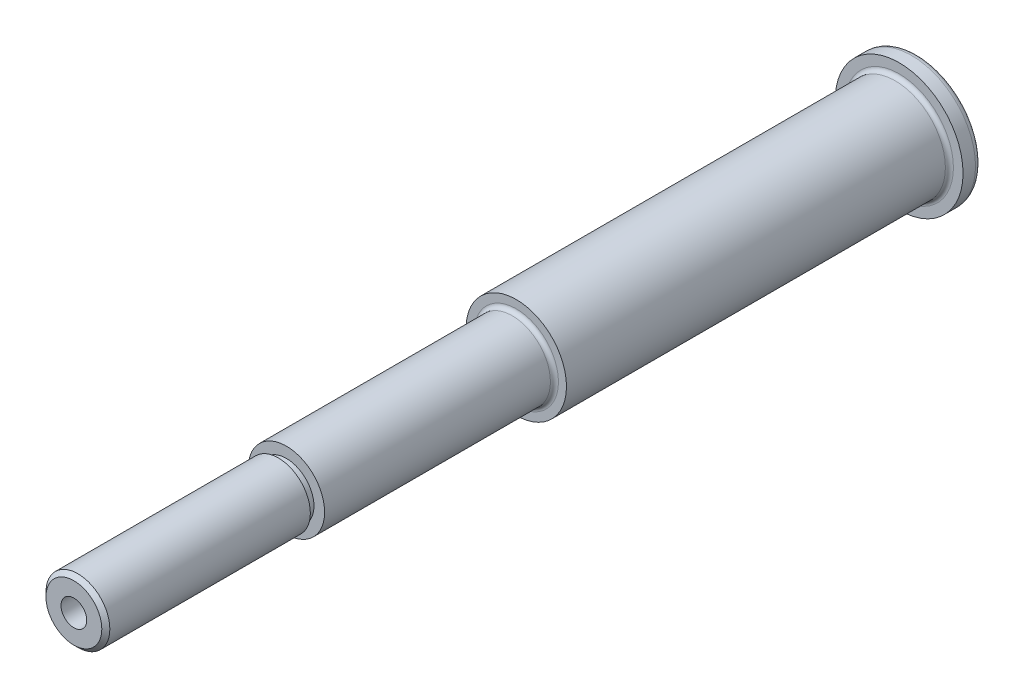
ISO-10303-21;
HEADER;
FILE_DESCRIPTION(('STEP AP214'),'2;1');
FILE_NAME('part.step','',(''),(''),'','','');
FILE_SCHEMA(('AUTOMOTIVE_DESIGN { 1 0 10303 214 1 1 1 1 }'));
ENDSEC;
DATA;
#1=APPLICATION_CONTEXT('core data for automotive mechanical design processes');
#2=APPLICATION_PROTOCOL_DEFINITION('international standard','automotive_design',2000,#1);
#3=PRODUCT_CONTEXT('',#1,'mechanical');
#4=PRODUCT('Part','Part','',(#3));
#5=PRODUCT_RELATED_PRODUCT_CATEGORY('part','',(#4));
#6=PRODUCT_DEFINITION_FORMATION('','',#4);
#7=PRODUCT_DEFINITION_CONTEXT('part definition',#1,'design');
#8=PRODUCT_DEFINITION('design','',#6,#7);
#9=PRODUCT_DEFINITION_SHAPE('','',#8);
#10=(LENGTH_UNIT() NAMED_UNIT(*) SI_UNIT(.MILLI.,.METRE.));
#11=(NAMED_UNIT(*) PLANE_ANGLE_UNIT() SI_UNIT($,.RADIAN.));
#12=(NAMED_UNIT(*) SI_UNIT($,.STERADIAN.) SOLID_ANGLE_UNIT());
#13=UNCERTAINTY_MEASURE_WITH_UNIT(LENGTH_MEASURE(1.E-05),#10,'distance_accuracy_value','');
#14=(GEOMETRIC_REPRESENTATION_CONTEXT(3) GLOBAL_UNCERTAINTY_ASSIGNED_CONTEXT((#13)) GLOBAL_UNIT_ASSIGNED_CONTEXT((#10,
#11,#12)) REPRESENTATION_CONTEXT('',''));
#15=CARTESIAN_POINT('',(0.,0.,0.));
#16=DIRECTION('',(0.,0.,1.));
#17=DIRECTION('',(1.,0.,0.));
#18=AXIS2_PLACEMENT_3D('',#15,#16,#17);
#19=CARTESIAN_POINT('',(0.,6.95,210.));
#20=DIRECTION('',(0.,0.,-1.));
#21=DIRECTION('',(-1.,0.,0.));
#22=AXIS2_PLACEMENT_3D('',#19,#20,#21);
#23=PLANE('',#22);
#24=CARTESIAN_POINT('',(0.,0.,210.));
#25=DIRECTION('',(0.,0.,1.));
#26=DIRECTION('',(1.,0.,0.));
#27=AXIS2_PLACEMENT_3D('',#24,#25,#26);
#28=CIRCLE('',#27,3.2);
#29=CARTESIAN_POINT('',(3.2,0.,210.));
#30=VERTEX_POINT('',#29);
#31=EDGE_CURVE('E80',#30,#30,#28,.T.);
#32=ORIENTED_EDGE('',*,*,#31,.F.);
#33=EDGE_LOOP('',(#32));
#34=FACE_BOUND('',#33,.T.);
#35=CARTESIAN_POINT('',(0.,0.,210.));
#36=DIRECTION('',(0.,0.,1.));
#37=DIRECTION('',(1.,0.,0.));
#38=AXIS2_PLACEMENT_3D('',#35,#36,#37);
#39=CIRCLE('',#38,6.95);
#40=CARTESIAN_POINT('',(6.95,0.,210.));
#41=VERTEX_POINT('',#40);
#42=EDGE_CURVE('E10',#41,#41,#39,.T.);
#43=ORIENTED_EDGE('',*,*,#42,.T.);
#44=EDGE_LOOP('',(#43));
#45=FACE_BOUND('',#44,.T.);
#46=ADVANCED_FACE('F30',(#34,#45),#23,.F.);
#47=CARTESIAN_POINT('',(0.,0.,209.));
#48=DIRECTION('',(0.,0.,-1.));
#49=DIRECTION('',(-1.,0.,0.));
#50=AXIS2_PLACEMENT_3D('',#47,#48,#49);
#51=CONICAL_SURFACE('',#50,7.94999999999999,0.785398163397445);
#52=ORIENTED_EDGE('',*,*,#42,.F.);
#53=EDGE_LOOP('',(#52));
#54=FACE_BOUND('',#53,.T.);
#55=CARTESIAN_POINT('',(0.,0.,209.));
#56=DIRECTION('',(0.,0.,1.));
#57=DIRECTION('',(1.,0.,0.));
#58=AXIS2_PLACEMENT_3D('',#55,#56,#57);
#59=CIRCLE('',#58,7.94999999999999);
#60=CARTESIAN_POINT('',(7.94999999999999,0.,209.));
#61=VERTEX_POINT('',#60);
#62=EDGE_CURVE('E36',#61,#61,#59,.T.);
#63=ORIENTED_EDGE('',*,*,#62,.T.);
#64=EDGE_LOOP('',(#63));
#65=FACE_BOUND('',#64,.T.);
#66=ADVANCED_FACE('F96',(#54,#65),#51,.T.);
#67=CARTESIAN_POINT('',(0.,0.,0.));
#68=DIRECTION('',(0.,0.,1.));
#69=DIRECTION('',(1.,0.,0.));
#70=AXIS2_PLACEMENT_3D('',#67,#68,#69);
#71=CYLINDRICAL_SURFACE('',#70,7.94999999999999);
#72=ORIENTED_EDGE('',*,*,#62,.F.);
#73=EDGE_LOOP('',(#72));
#74=FACE_BOUND('',#73,.T.);
#75=CARTESIAN_POINT('',(0.,0.,159.1));
#76=DIRECTION('',(0.,0.,1.));
#77=DIRECTION('',(1.,0.,0.));
#78=AXIS2_PLACEMENT_3D('',#75,#76,#77);
#79=CIRCLE('',#78,7.95);
#80=CARTESIAN_POINT('',(7.95,0.,159.1));
#81=VERTEX_POINT('',#80);
#82=EDGE_CURVE('E40',#81,#81,#79,.T.);
#83=ORIENTED_EDGE('',*,*,#82,.T.);
#84=EDGE_LOOP('',(#83));
#85=FACE_BOUND('',#84,.T.);
#86=ADVANCED_FACE('F100',(#74,#85),#71,.T.);
#87=CARTESIAN_POINT('',(0.,6.85,159.1));
#88=DIRECTION('',(0.,0.,1.));
#89=DIRECTION('',(1.,0.,0.));
#90=AXIS2_PLACEMENT_3D('',#87,#88,#89);
#91=PLANE('',#90);
#92=ORIENTED_EDGE('',*,*,#82,.F.);
#93=EDGE_LOOP('',(#92));
#94=FACE_BOUND('',#93,.T.);
#95=CARTESIAN_POINT('',(0.,0.,159.1));
#96=DIRECTION('',(0.,0.,1.));
#97=DIRECTION('',(1.,0.,0.));
#98=AXIS2_PLACEMENT_3D('',#95,#96,#97);
#99=CIRCLE('',#98,6.85);
#100=CARTESIAN_POINT('',(6.85,0.,159.1));
#101=VERTEX_POINT('',#100);
#102=EDGE_CURVE('E44',#101,#101,#99,.T.);
#103=ORIENTED_EDGE('',*,*,#102,.T.);
#104=EDGE_LOOP('',(#103));
#105=FACE_BOUND('',#104,.T.);
#106=ADVANCED_FACE('F105',(#94,#105),#91,.F.);
#107=CARTESIAN_POINT('',(0.,0.,0.));
#108=DIRECTION('',(0.,0.,1.));
#109=DIRECTION('',(1.,0.,0.));
#110=AXIS2_PLACEMENT_3D('',#107,#108,#109);
#111=CYLINDRICAL_SURFACE('',#110,6.85);
#112=ORIENTED_EDGE('',*,*,#102,.F.);
#113=EDGE_LOOP('',(#112));
#114=FACE_BOUND('',#113,.T.);
#115=CARTESIAN_POINT('',(0.,0.,157.1));
#116=DIRECTION('',(0.,0.,1.));
#117=DIRECTION('',(1.,0.,0.));
#118=AXIS2_PLACEMENT_3D('',#115,#116,#117);
#119=CIRCLE('',#118,6.85);
#120=CARTESIAN_POINT('',(6.85,0.,157.1));
#121=VERTEX_POINT('',#120);
#122=EDGE_CURVE('E49',#121,#121,#119,.T.);
#123=ORIENTED_EDGE('',*,*,#122,.T.);
#124=EDGE_LOOP('',(#123));
#125=FACE_BOUND('',#124,.T.);
#126=ADVANCED_FACE('F111',(#114,#125),#111,.T.);
#127=CARTESIAN_POINT('',(0.,9.49999999999999,157.1));
#128=DIRECTION('',(0.,0.,-1.));
#129=DIRECTION('',(-1.,0.,0.));
#130=AXIS2_PLACEMENT_3D('',#127,#128,#129);
#131=PLANE('',#130);
#132=ORIENTED_EDGE('',*,*,#122,.F.);
#133=EDGE_LOOP('',(#132));
#134=FACE_BOUND('',#133,.T.);
#135=CARTESIAN_POINT('',(0.,0.,157.1));
#136=DIRECTION('',(0.,0.,1.));
#137=DIRECTION('',(1.,0.,0.));
#138=AXIS2_PLACEMENT_3D('',#135,#136,#137);
#139=CIRCLE('',#138,9.49999999999999);
#140=CARTESIAN_POINT('',(9.49999999999999,0.,157.1));
#141=VERTEX_POINT('',#140);
#142=EDGE_CURVE('E52',#141,#141,#139,.T.);
#143=ORIENTED_EDGE('',*,*,#142,.T.);
#144=EDGE_LOOP('',(#143));
#145=FACE_BOUND('',#144,.T.);
#146=ADVANCED_FACE('F115',(#134,#145),#131,.F.);
#147=CARTESIAN_POINT('',(0.,0.,0.));
#148=DIRECTION('',(0.,0.,1.));
#149=DIRECTION('',(1.,0.,0.));
#150=AXIS2_PLACEMENT_3D('',#147,#148,#149);
#151=CYLINDRICAL_SURFACE('',#150,9.49999999999999);
#152=ORIENTED_EDGE('',*,*,#142,.F.);
#153=EDGE_LOOP('',(#152));
#154=FACE_BOUND('',#153,.T.);
#155=CARTESIAN_POINT('',(0.,0.,100.9));
#156=DIRECTION('',(0.,0.,1.));
#157=DIRECTION('',(1.,0.,0.));
#158=AXIS2_PLACEMENT_3D('',#155,#156,#157);
#159=CIRCLE('',#158,9.49999999999999);
#160=CARTESIAN_POINT('',(9.49999999999999,0.,100.9));
#161=VERTEX_POINT('',#160);
#162=EDGE_CURVE('E55',#161,#161,#159,.T.);
#163=ORIENTED_EDGE('',*,*,#162,.T.);
#164=EDGE_LOOP('',(#163));
#165=FACE_BOUND('',#164,.T.);
#166=ADVANCED_FACE('F119',(#154,#165),#151,.T.);
#167=CARTESIAN_POINT('',(0.,0.,100.9));
#168=DIRECTION('',(0.,0.,1.));
#169=DIRECTION('',(1.,0.,0.));
#170=AXIS2_PLACEMENT_3D('',#167,#168,#169);
#171=TOROIDAL_SURFACE('',#170,10.5,1.00000000000001);
#172=ORIENTED_EDGE('',*,*,#162,.F.);
#173=EDGE_LOOP('',(#172));
#174=FACE_BOUND('',#173,.T.);
#175=CARTESIAN_POINT('',(0.,0.,99.9));
#176=DIRECTION('',(0.,0.,1.));
#177=DIRECTION('',(1.,0.,0.));
#178=AXIS2_PLACEMENT_3D('',#175,#176,#177);
#179=CIRCLE('',#178,10.5);
#180=CARTESIAN_POINT('',(10.5,0.,99.9));
#181=VERTEX_POINT('',#180);
#182=EDGE_CURVE('E58',#181,#181,#179,.T.);
#183=ORIENTED_EDGE('',*,*,#182,.T.);
#184=EDGE_LOOP('',(#183));
#185=FACE_BOUND('',#184,.T.);
#186=ADVANCED_FACE('F123',(#174,#185),#171,.F.);
#187=CARTESIAN_POINT('',(0.,12.5,99.9));
#188=DIRECTION('',(0.,0.,-1.));
#189=DIRECTION('',(-1.,0.,0.));
#190=AXIS2_PLACEMENT_3D('',#187,#188,#189);
#191=PLANE('',#190);
#192=ORIENTED_EDGE('',*,*,#182,.F.);
#193=EDGE_LOOP('',(#192));
#194=FACE_BOUND('',#193,.T.);
#195=CARTESIAN_POINT('',(0.,0.,99.9));
#196=DIRECTION('',(0.,0.,1.));
#197=DIRECTION('',(1.,0.,0.));
#198=AXIS2_PLACEMENT_3D('',#195,#196,#197);
#199=CIRCLE('',#198,12.5);
#200=CARTESIAN_POINT('',(12.5,0.,99.9));
#201=VERTEX_POINT('',#200);
#202=EDGE_CURVE('E61',#201,#201,#199,.T.);
#203=ORIENTED_EDGE('',*,*,#202,.T.);
#204=EDGE_LOOP('',(#203));
#205=FACE_BOUND('',#204,.T.);
#206=ADVANCED_FACE('F127',(#194,#205),#191,.F.);
#207=CARTESIAN_POINT('',(0.,0.,0.));
#208=DIRECTION('',(0.,0.,1.));
#209=DIRECTION('',(1.,0.,0.));
#210=AXIS2_PLACEMENT_3D('',#207,#208,#209);
#211=CYLINDRICAL_SURFACE('',#210,12.5);
#212=ORIENTED_EDGE('',*,*,#202,.F.);
#213=EDGE_LOOP('',(#212));
#214=FACE_BOUND('',#213,.T.);
#215=CARTESIAN_POINT('',(0.,0.,5.6));
#216=DIRECTION('',(0.,0.,1.));
#217=DIRECTION('',(1.,0.,0.));
#218=AXIS2_PLACEMENT_3D('',#215,#216,#217);
#219=CIRCLE('',#218,12.5);
#220=CARTESIAN_POINT('',(12.5,0.,5.6));
#221=VERTEX_POINT('',#220);
#222=EDGE_CURVE('E64',#221,#221,#219,.T.);
#223=ORIENTED_EDGE('',*,*,#222,.T.);
#224=EDGE_LOOP('',(#223));
#225=FACE_BOUND('',#224,.T.);
#226=ADVANCED_FACE('F131',(#214,#225),#211,.T.);
#227=CARTESIAN_POINT('',(0.,0.,5.6));
#228=DIRECTION('',(0.,0.,1.));
#229=DIRECTION('',(1.,0.,0.));
#230=AXIS2_PLACEMENT_3D('',#227,#228,#229);
#231=TOROIDAL_SURFACE('',#230,13.5,1.);
#232=ORIENTED_EDGE('',*,*,#222,.F.);
#233=EDGE_LOOP('',(#232));
#234=FACE_BOUND('',#233,.T.);
#235=CARTESIAN_POINT('',(0.,0.,4.6));
#236=DIRECTION('',(0.,0.,1.));
#237=DIRECTION('',(1.,0.,0.));
#238=AXIS2_PLACEMENT_3D('',#235,#236,#237);
#239=CIRCLE('',#238,13.5);
#240=CARTESIAN_POINT('',(13.5,0.,4.6));
#241=VERTEX_POINT('',#240);
#242=EDGE_CURVE('E67',#241,#241,#239,.T.);
#243=ORIENTED_EDGE('',*,*,#242,.T.);
#244=EDGE_LOOP('',(#243));
#245=FACE_BOUND('',#244,.T.);
#246=ADVANCED_FACE('F135',(#234,#245),#231,.F.);
#247=CARTESIAN_POINT('',(0.,15.9,4.6));
#248=DIRECTION('',(0.,0.,-1.));
#249=DIRECTION('',(-1.,0.,0.));
#250=AXIS2_PLACEMENT_3D('',#247,#248,#249);
#251=PLANE('',#250);
#252=ORIENTED_EDGE('',*,*,#242,.F.);
#253=EDGE_LOOP('',(#252));
#254=FACE_BOUND('',#253,.T.);
#255=CARTESIAN_POINT('',(0.,0.,4.6));
#256=DIRECTION('',(0.,0.,1.));
#257=DIRECTION('',(1.,0.,0.));
#258=AXIS2_PLACEMENT_3D('',#255,#256,#257);
#259=CIRCLE('',#258,15.9);
#260=CARTESIAN_POINT('',(15.9,0.,4.6));
#261=VERTEX_POINT('',#260);
#262=EDGE_CURVE('E70',#261,#261,#259,.T.);
#263=ORIENTED_EDGE('',*,*,#262,.T.);
#264=EDGE_LOOP('',(#263));
#265=FACE_BOUND('',#264,.T.);
#266=ADVANCED_FACE('F139',(#254,#265),#251,.F.);
#267=CARTESIAN_POINT('',(0.,0.,0.));
#268=DIRECTION('',(0.,0.,1.));
#269=DIRECTION('',(1.,0.,0.));
#270=AXIS2_PLACEMENT_3D('',#267,#268,#269);
#271=CYLINDRICAL_SURFACE('',#270,15.9);
#272=ORIENTED_EDGE('',*,*,#262,.F.);
#273=EDGE_LOOP('',(#272));
#274=FACE_BOUND('',#273,.T.);
#275=CARTESIAN_POINT('',(0.,0.,1.5));
#276=DIRECTION('',(0.,0.,1.));
#277=DIRECTION('',(1.,0.,0.));
#278=AXIS2_PLACEMENT_3D('',#275,#276,#277);
#279=CIRCLE('',#278,15.9);
#280=CARTESIAN_POINT('',(15.9,0.,1.5));
#281=VERTEX_POINT('',#280);
#282=EDGE_CURVE('E73',#281,#281,#279,.T.);
#283=ORIENTED_EDGE('',*,*,#282,.T.);
#284=EDGE_LOOP('',(#283));
#285=FACE_BOUND('',#284,.T.);
#286=ADVANCED_FACE('F143',(#274,#285),#271,.T.);
#287=CARTESIAN_POINT('',(0.,0.,1.5));
#288=DIRECTION('',(0.,0.,1.));
#289=DIRECTION('',(1.,0.,0.));
#290=AXIS2_PLACEMENT_3D('',#287,#288,#289);
#291=TOROIDAL_SURFACE('',#290,14.4,1.5);
#292=ORIENTED_EDGE('',*,*,#282,.F.);
#293=EDGE_LOOP('',(#292));
#294=FACE_BOUND('',#293,.T.);
#295=CARTESIAN_POINT('',(0.,0.,0.));
#296=DIRECTION('',(0.,0.,1.));
#297=DIRECTION('',(1.,0.,0.));
#298=AXIS2_PLACEMENT_3D('',#295,#296,#297);
#299=CIRCLE('',#298,14.4);
#300=CARTESIAN_POINT('',(14.4,0.,0.));
#301=VERTEX_POINT('',#300);
#302=EDGE_CURVE('E76',#301,#301,#299,.T.);
#303=ORIENTED_EDGE('',*,*,#302,.T.);
#304=EDGE_LOOP('',(#303));
#305=FACE_BOUND('',#304,.T.);
#306=ADVANCED_FACE('F147',(#294,#305),#291,.T.);
#307=CARTESIAN_POINT('',(0.,0.,0.));
#308=DIRECTION('',(0.,0.,1.));
#309=DIRECTION('',(1.,0.,0.));
#310=AXIS2_PLACEMENT_3D('',#307,#308,#309);
#311=PLANE('',#310);
#312=ORIENTED_EDGE('',*,*,#302,.F.);
#313=EDGE_LOOP('',(#312));
#314=FACE_BOUND('',#313,.T.);
#315=ADVANCED_FACE('F91',(#314),#311,.F.);
#316=CARTESIAN_POINT('',(0.,0.,175.));
#317=DIRECTION('',(0.,0.,1.));
#318=DIRECTION('',(1.,0.,0.));
#319=AXIS2_PLACEMENT_3D('',#316,#317,#318);
#320=CYLINDRICAL_SURFACE('',#319,3.2);
#321=CARTESIAN_POINT('',(0.,0.,175.));
#322=DIRECTION('',(0.,0.,1.));
#323=DIRECTION('',(1.,0.,0.));
#324=AXIS2_PLACEMENT_3D('',#321,#322,#323);
#325=CIRCLE('',#324,3.2);
#326=CARTESIAN_POINT('',(3.2,0.,175.));
#327=VERTEX_POINT('',#326);
#328=EDGE_CURVE('E79',#327,#327,#325,.T.);
#329=ORIENTED_EDGE('',*,*,#328,.F.);
#330=EDGE_LOOP('',(#329));
#331=FACE_BOUND('',#330,.T.);
#332=ORIENTED_EDGE('',*,*,#31,.T.);
#333=EDGE_LOOP('',(#332));
#334=FACE_BOUND('',#333,.T.);
#335=ADVANCED_FACE('F88',(#331,#334),#320,.F.);
#336=CARTESIAN_POINT('',(0.,0.,175.));
#337=DIRECTION('',(0.,0.,1.));
#338=DIRECTION('',(1.,0.,0.));
#339=AXIS2_PLACEMENT_3D('',#336,#337,#338);
#340=PLANE('',#339);
#341=ORIENTED_EDGE('',*,*,#328,.T.);
#342=EDGE_LOOP('',(#341));
#343=FACE_BOUND('',#342,.T.);
#344=ADVANCED_FACE('F86',(#343),#340,.T.);
#345=CLOSED_SHELL('',(#46,#66,#86,#106,#126,#146,#166,#186,#206,#226,#246,#266,#286,#306,#315,
#335,#344));
#346=MANIFOLD_SOLID_BREP('B2',#345);
#347=ADVANCED_BREP_SHAPE_REPRESENTATION('',(#18,#346),#14);
#348=SHAPE_DEFINITION_REPRESENTATION(#9,#347);
ENDSEC;
END-ISO-10303-21;
